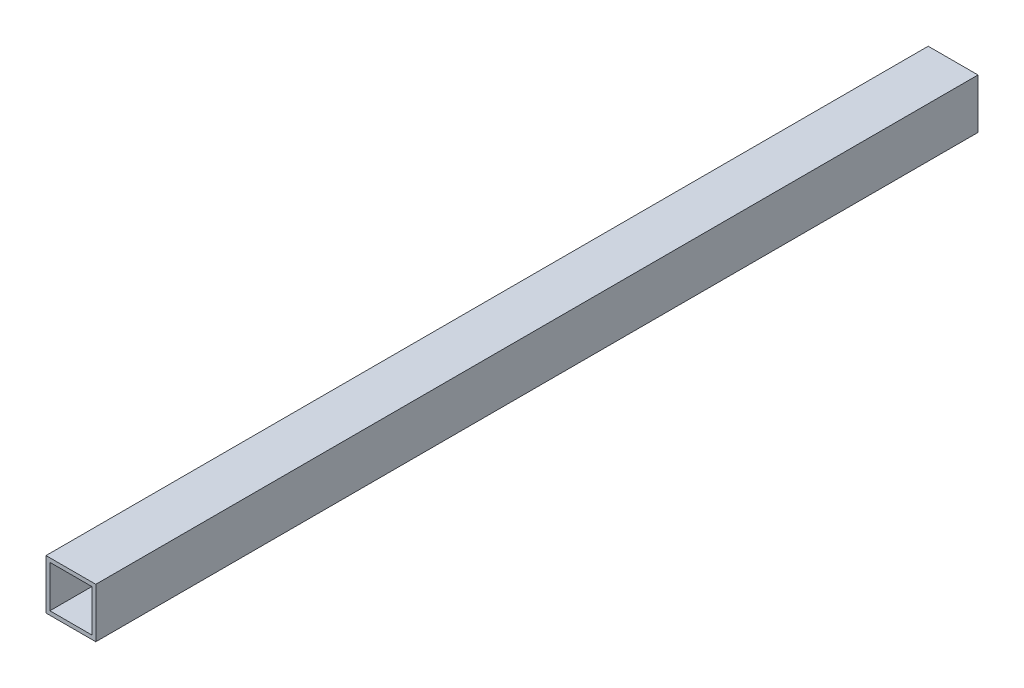
ISO-10303-21;
HEADER;
FILE_DESCRIPTION(('STEP AP214'),'2;1');
FILE_NAME('part.step','',(''),(''),'','','');
FILE_SCHEMA(('AUTOMOTIVE_DESIGN { 1 0 10303 214 1 1 1 1 }'));
ENDSEC;
DATA;
#1=APPLICATION_CONTEXT('core data for automotive mechanical design processes');
#2=APPLICATION_PROTOCOL_DEFINITION('international standard','automotive_design',2000,#1);
#3=PRODUCT_CONTEXT('',#1,'mechanical');
#4=PRODUCT('Part','Part','',(#3));
#5=PRODUCT_RELATED_PRODUCT_CATEGORY('part','',(#4));
#6=PRODUCT_DEFINITION_FORMATION('','',#4);
#7=PRODUCT_DEFINITION_CONTEXT('part definition',#1,'design');
#8=PRODUCT_DEFINITION('design','',#6,#7);
#9=PRODUCT_DEFINITION_SHAPE('','',#8);
#10=(LENGTH_UNIT() NAMED_UNIT(*) SI_UNIT(.MILLI.,.METRE.));
#11=(NAMED_UNIT(*) PLANE_ANGLE_UNIT() SI_UNIT($,.RADIAN.));
#12=(NAMED_UNIT(*) SI_UNIT($,.STERADIAN.) SOLID_ANGLE_UNIT());
#13=UNCERTAINTY_MEASURE_WITH_UNIT(LENGTH_MEASURE(1.E-05),#10,'distance_accuracy_value','');
#14=(GEOMETRIC_REPRESENTATION_CONTEXT(3) GLOBAL_UNCERTAINTY_ASSIGNED_CONTEXT((#13)) GLOBAL_UNIT_ASSIGNED_CONTEXT((#10,
#11,#12)) REPRESENTATION_CONTEXT('',''));
#15=CARTESIAN_POINT('',(0.,0.,0.));
#16=DIRECTION('',(0.,0.,1.));
#17=DIRECTION('',(1.,0.,0.));
#18=AXIS2_PLACEMENT_3D('',#15,#16,#17);
#19=CARTESIAN_POINT('',(0.,0.,450.));
#20=DIRECTION('',(0.,0.,1.));
#21=DIRECTION('',(1.,0.,0.));
#22=AXIS2_PLACEMENT_3D('',#19,#20,#21);
#23=PLANE('',#22);
#24=DIRECTION('',(0.,-1.,0.));
#25=VECTOR('',#24,1.);
#26=CARTESIAN_POINT('',(-12.7,12.7,450.));
#27=LINE('',#26,#25);
#28=CARTESIAN_POINT('',(-12.7,12.7,450.));
#29=VERTEX_POINT('',#28);
#30=CARTESIAN_POINT('',(-12.7,-12.7,450.));
#31=VERTEX_POINT('',#30);
#32=EDGE_CURVE('E137',#29,#31,#27,.T.);
#33=ORIENTED_EDGE('',*,*,#32,.T.);
#34=DIRECTION('',(1.,0.,0.));
#35=VECTOR('',#34,1.);
#36=CARTESIAN_POINT('',(-12.7,-12.7,450.));
#37=LINE('',#36,#35);
#38=CARTESIAN_POINT('',(12.7,-12.7,450.));
#39=VERTEX_POINT('',#38);
#40=EDGE_CURVE('E140',#31,#39,#37,.T.);
#41=ORIENTED_EDGE('',*,*,#40,.T.);
#42=DIRECTION('',(0.,-1.,0.));
#43=VECTOR('',#42,1.);
#44=CARTESIAN_POINT('',(12.7,12.7,450.));
#45=LINE('',#44,#43);
#46=CARTESIAN_POINT('',(12.7,12.7,450.));
#47=VERTEX_POINT('',#46);
#48=EDGE_CURVE('E143',#47,#39,#45,.T.);
#49=ORIENTED_EDGE('',*,*,#48,.F.);
#50=DIRECTION('',(1.,0.,0.));
#51=VECTOR('',#50,1.);
#52=CARTESIAN_POINT('',(-12.7,12.7,450.));
#53=LINE('',#52,#51);
#54=EDGE_CURVE('E146',#29,#47,#53,.T.);
#55=ORIENTED_EDGE('',*,*,#54,.F.);
#56=EDGE_LOOP('',(#33,#41,#49,#55));
#57=FACE_BOUND('',#56,.T.);
#58=DIRECTION('',(1.,0.,0.));
#59=VECTOR('',#58,1.);
#60=CARTESIAN_POINT('',(-10.7,-10.7,450.));
#61=LINE('',#60,#59);
#62=CARTESIAN_POINT('',(-10.7,-10.7,450.));
#63=VERTEX_POINT('',#62);
#64=CARTESIAN_POINT('',(10.7,-10.7,450.));
#65=VERTEX_POINT('',#64);
#66=EDGE_CURVE('E111',#63,#65,#61,.T.);
#67=ORIENTED_EDGE('',*,*,#66,.F.);
#68=DIRECTION('',(0.,-1.,0.));
#69=VECTOR('',#68,1.);
#70=CARTESIAN_POINT('',(-10.7,10.7,450.));
#71=LINE('',#70,#69);
#72=CARTESIAN_POINT('',(-10.7,10.7,450.));
#73=VERTEX_POINT('',#72);
#74=EDGE_CURVE('E102',#73,#63,#71,.T.);
#75=ORIENTED_EDGE('',*,*,#74,.F.);
#76=DIRECTION('',(1.,0.,0.));
#77=VECTOR('',#76,1.);
#78=CARTESIAN_POINT('',(-10.7,10.7,450.));
#79=LINE('',#78,#77);
#80=CARTESIAN_POINT('',(10.7,10.7,450.));
#81=VERTEX_POINT('',#80);
#82=EDGE_CURVE('E122',#73,#81,#79,.T.);
#83=ORIENTED_EDGE('',*,*,#82,.T.);
#84=DIRECTION('',(0.,-1.,0.));
#85=VECTOR('',#84,1.);
#86=CARTESIAN_POINT('',(10.7,10.7,450.));
#87=LINE('',#86,#85);
#88=EDGE_CURVE('E52',#81,#65,#87,.T.);
#89=ORIENTED_EDGE('',*,*,#88,.T.);
#90=EDGE_LOOP('',(#67,#75,#83,#89));
#91=FACE_BOUND('',#90,.T.);
#92=ADVANCED_FACE('F37',(#57,#91),#23,.T.);
#93=CARTESIAN_POINT('',(0.,0.,0.));
#94=DIRECTION('',(0.,0.,1.));
#95=DIRECTION('',(1.,0.,0.));
#96=AXIS2_PLACEMENT_3D('',#93,#94,#95);
#97=PLANE('',#96);
#98=DIRECTION('',(0.,-1.,0.));
#99=VECTOR('',#98,1.);
#100=CARTESIAN_POINT('',(-12.7,12.7,0.));
#101=LINE('',#100,#99);
#102=CARTESIAN_POINT('',(-12.7,12.7,0.));
#103=VERTEX_POINT('',#102);
#104=CARTESIAN_POINT('',(-12.7,-12.7,0.));
#105=VERTEX_POINT('',#104);
#106=EDGE_CURVE('E118',#103,#105,#101,.T.);
#107=ORIENTED_EDGE('',*,*,#106,.F.);
#108=DIRECTION('',(1.,0.,0.));
#109=VECTOR('',#108,1.);
#110=CARTESIAN_POINT('',(-12.7,12.7,0.));
#111=LINE('',#110,#109);
#112=CARTESIAN_POINT('',(12.7,12.7,0.));
#113=VERTEX_POINT('',#112);
#114=EDGE_CURVE('E141',#103,#113,#111,.T.);
#115=ORIENTED_EDGE('',*,*,#114,.T.);
#116=DIRECTION('',(0.,-1.,0.));
#117=VECTOR('',#116,1.);
#118=CARTESIAN_POINT('',(12.7,12.7,0.));
#119=LINE('',#118,#117);
#120=CARTESIAN_POINT('',(12.7,-12.7,0.));
#121=VERTEX_POINT('',#120);
#122=EDGE_CURVE('E155',#113,#121,#119,.T.);
#123=ORIENTED_EDGE('',*,*,#122,.T.);
#124=DIRECTION('',(1.,0.,0.));
#125=VECTOR('',#124,1.);
#126=CARTESIAN_POINT('',(-12.7,-12.7,0.));
#127=LINE('',#126,#125);
#128=EDGE_CURVE('E152',#105,#121,#127,.T.);
#129=ORIENTED_EDGE('',*,*,#128,.F.);
#130=EDGE_LOOP('',(#107,#115,#123,#129));
#131=FACE_BOUND('',#130,.T.);
#132=DIRECTION('',(0.,-1.,0.));
#133=VECTOR('',#132,1.);
#134=CARTESIAN_POINT('',(-10.7,10.7,0.));
#135=LINE('',#134,#133);
#136=CARTESIAN_POINT('',(-10.7,10.7,0.));
#137=VERTEX_POINT('',#136);
#138=CARTESIAN_POINT('',(-10.7,-10.7,0.));
#139=VERTEX_POINT('',#138);
#140=EDGE_CURVE('E60',#137,#139,#135,.T.);
#141=ORIENTED_EDGE('',*,*,#140,.T.);
#142=DIRECTION('',(1.,0.,0.));
#143=VECTOR('',#142,1.);
#144=CARTESIAN_POINT('',(-10.7,-10.7,0.));
#145=LINE('',#144,#143);
#146=CARTESIAN_POINT('',(10.7,-10.7,0.));
#147=VERTEX_POINT('',#146);
#148=EDGE_CURVE('E117',#139,#147,#145,.T.);
#149=ORIENTED_EDGE('',*,*,#148,.T.);
#150=DIRECTION('',(0.,-1.,0.));
#151=VECTOR('',#150,1.);
#152=CARTESIAN_POINT('',(10.7,10.7,0.));
#153=LINE('',#152,#151);
#154=CARTESIAN_POINT('',(10.7,10.7,0.));
#155=VERTEX_POINT('',#154);
#156=EDGE_CURVE('E128',#155,#147,#153,.T.);
#157=ORIENTED_EDGE('',*,*,#156,.F.);
#158=DIRECTION('',(1.,0.,0.));
#159=VECTOR('',#158,1.);
#160=CARTESIAN_POINT('',(-10.7,10.7,0.));
#161=LINE('',#160,#159);
#162=EDGE_CURVE('E112',#137,#155,#161,.T.);
#163=ORIENTED_EDGE('',*,*,#162,.F.);
#164=EDGE_LOOP('',(#141,#149,#157,#163));
#165=FACE_BOUND('',#164,.T.);
#166=ADVANCED_FACE('F172',(#131,#165),#97,.F.);
#167=CARTESIAN_POINT('',(-12.7,12.7,450.));
#168=DIRECTION('',(1.,0.,0.));
#169=DIRECTION('',(0.,1.,0.));
#170=AXIS2_PLACEMENT_3D('',#167,#168,#169);
#171=PLANE('',#170);
#172=ORIENTED_EDGE('',*,*,#106,.T.);
#173=DIRECTION('',(0.,0.,-1.));
#174=VECTOR('',#173,1.);
#175=CARTESIAN_POINT('',(-12.7,-12.7,450.));
#176=LINE('',#175,#174);
#177=EDGE_CURVE('E11',#31,#105,#176,.T.);
#178=ORIENTED_EDGE('',*,*,#177,.F.);
#179=ORIENTED_EDGE('',*,*,#32,.F.);
#180=DIRECTION('',(0.,0.,-1.));
#181=VECTOR('',#180,1.);
#182=CARTESIAN_POINT('',(-12.7,12.7,450.));
#183=LINE('',#182,#181);
#184=EDGE_CURVE('E149',#29,#103,#183,.T.);
#185=ORIENTED_EDGE('',*,*,#184,.T.);
#186=EDGE_LOOP('',(#172,#178,#179,#185));
#187=FACE_BOUND('',#186,.T.);
#188=ADVANCED_FACE('F39',(#187),#171,.F.);
#189=CARTESIAN_POINT('',(-12.7,-12.7,450.));
#190=DIRECTION('',(0.,1.,0.));
#191=DIRECTION('',(0.,0.,1.));
#192=AXIS2_PLACEMENT_3D('',#189,#190,#191);
#193=PLANE('',#192);
#194=ORIENTED_EDGE('',*,*,#128,.T.);
#195=DIRECTION('',(0.,0.,-1.));
#196=VECTOR('',#195,1.);
#197=CARTESIAN_POINT('',(12.7,-12.7,450.));
#198=LINE('',#197,#196);
#199=EDGE_CURVE('E45',#39,#121,#198,.T.);
#200=ORIENTED_EDGE('',*,*,#199,.F.);
#201=ORIENTED_EDGE('',*,*,#40,.F.);
#202=ORIENTED_EDGE('',*,*,#177,.T.);
#203=EDGE_LOOP('',(#194,#200,#201,#202));
#204=FACE_BOUND('',#203,.T.);
#205=ADVANCED_FACE('F168',(#204),#193,.F.);
#206=CARTESIAN_POINT('',(12.7,12.7,450.));
#207=DIRECTION('',(1.,0.,0.));
#208=DIRECTION('',(0.,1.,0.));
#209=AXIS2_PLACEMENT_3D('',#206,#207,#208);
#210=PLANE('',#209);
#211=ORIENTED_EDGE('',*,*,#122,.F.);
#212=DIRECTION('',(0.,0.,-1.));
#213=VECTOR('',#212,1.);
#214=CARTESIAN_POINT('',(12.7,12.7,450.));
#215=LINE('',#214,#213);
#216=EDGE_CURVE('E161',#47,#113,#215,.T.);
#217=ORIENTED_EDGE('',*,*,#216,.F.);
#218=ORIENTED_EDGE('',*,*,#48,.T.);
#219=ORIENTED_EDGE('',*,*,#199,.T.);
#220=EDGE_LOOP('',(#211,#217,#218,#219));
#221=FACE_BOUND('',#220,.T.);
#222=ADVANCED_FACE('F165',(#221),#210,.T.);
#223=CARTESIAN_POINT('',(-12.7,12.7,450.));
#224=DIRECTION('',(0.,1.,0.));
#225=DIRECTION('',(0.,0.,1.));
#226=AXIS2_PLACEMENT_3D('',#223,#224,#225);
#227=PLANE('',#226);
#228=ORIENTED_EDGE('',*,*,#114,.F.);
#229=ORIENTED_EDGE('',*,*,#184,.F.);
#230=ORIENTED_EDGE('',*,*,#54,.T.);
#231=ORIENTED_EDGE('',*,*,#216,.T.);
#232=EDGE_LOOP('',(#228,#229,#230,#231));
#233=FACE_BOUND('',#232,.T.);
#234=ADVANCED_FACE('F176',(#233),#227,.T.);
#235=CARTESIAN_POINT('',(-10.7,10.7,450.));
#236=DIRECTION('',(1.,0.,0.));
#237=DIRECTION('',(0.,0.,-1.));
#238=AXIS2_PLACEMENT_3D('',#235,#236,#237);
#239=PLANE('',#238);
#240=ORIENTED_EDGE('',*,*,#140,.F.);
#241=DIRECTION('',(0.,0.,-1.));
#242=VECTOR('',#241,1.);
#243=CARTESIAN_POINT('',(-10.7,10.7,450.));
#244=LINE('',#243,#242);
#245=EDGE_CURVE('E106',#73,#137,#244,.T.);
#246=ORIENTED_EDGE('',*,*,#245,.F.);
#247=ORIENTED_EDGE('',*,*,#74,.T.);
#248=DIRECTION('',(0.,0.,-1.));
#249=VECTOR('',#248,1.);
#250=CARTESIAN_POINT('',(-10.7,-10.7,450.));
#251=LINE('',#250,#249);
#252=EDGE_CURVE('E105',#63,#139,#251,.T.);
#253=ORIENTED_EDGE('',*,*,#252,.T.);
#254=EDGE_LOOP('',(#240,#246,#247,#253));
#255=FACE_BOUND('',#254,.T.);
#256=ADVANCED_FACE('F104',(#255),#239,.T.);
#257=CARTESIAN_POINT('',(-10.7,-10.7,450.));
#258=DIRECTION('',(0.,1.,0.));
#259=DIRECTION('',(-1.,0.,0.));
#260=AXIS2_PLACEMENT_3D('',#257,#258,#259);
#261=PLANE('',#260);
#262=ORIENTED_EDGE('',*,*,#148,.F.);
#263=ORIENTED_EDGE('',*,*,#252,.F.);
#264=ORIENTED_EDGE('',*,*,#66,.T.);
#265=DIRECTION('',(0.,0.,-1.));
#266=VECTOR('',#265,1.);
#267=CARTESIAN_POINT('',(10.7,-10.7,450.));
#268=LINE('',#267,#266);
#269=EDGE_CURVE('E119',#65,#147,#268,.T.);
#270=ORIENTED_EDGE('',*,*,#269,.T.);
#271=EDGE_LOOP('',(#262,#263,#264,#270));
#272=FACE_BOUND('',#271,.T.);
#273=ADVANCED_FACE('F115',(#272),#261,.T.);
#274=CARTESIAN_POINT('',(10.7,10.7,450.));
#275=DIRECTION('',(1.,0.,0.));
#276=DIRECTION('',(0.,1.,0.));
#277=AXIS2_PLACEMENT_3D('',#274,#275,#276);
#278=PLANE('',#277);
#279=ORIENTED_EDGE('',*,*,#156,.T.);
#280=ORIENTED_EDGE('',*,*,#269,.F.);
#281=ORIENTED_EDGE('',*,*,#88,.F.);
#282=DIRECTION('',(0.,0.,-1.));
#283=VECTOR('',#282,1.);
#284=CARTESIAN_POINT('',(10.7,10.7,450.));
#285=LINE('',#284,#283);
#286=EDGE_CURVE('E134',#81,#155,#285,.T.);
#287=ORIENTED_EDGE('',*,*,#286,.T.);
#288=EDGE_LOOP('',(#279,#280,#281,#287));
#289=FACE_BOUND('',#288,.T.);
#290=ADVANCED_FACE('F217',(#289),#278,.F.);
#291=CARTESIAN_POINT('',(-10.7,10.7,450.));
#292=DIRECTION('',(0.,1.,0.));
#293=DIRECTION('',(0.,0.,1.));
#294=AXIS2_PLACEMENT_3D('',#291,#292,#293);
#295=PLANE('',#294);
#296=ORIENTED_EDGE('',*,*,#162,.T.);
#297=ORIENTED_EDGE('',*,*,#286,.F.);
#298=ORIENTED_EDGE('',*,*,#82,.F.);
#299=ORIENTED_EDGE('',*,*,#245,.T.);
#300=EDGE_LOOP('',(#296,#297,#298,#299));
#301=FACE_BOUND('',#300,.T.);
#302=ADVANCED_FACE('F223',(#301),#295,.F.);
#303=CLOSED_SHELL('',(#92,#166,#188,#205,#222,#234,#256,#273,#290,#302));
#304=MANIFOLD_SOLID_BREP('B2',#303);
#305=ADVANCED_BREP_SHAPE_REPRESENTATION('',(#18,#304),#14);
#306=SHAPE_DEFINITION_REPRESENTATION(#9,#305);
ENDSEC;
END-ISO-10303-21;
